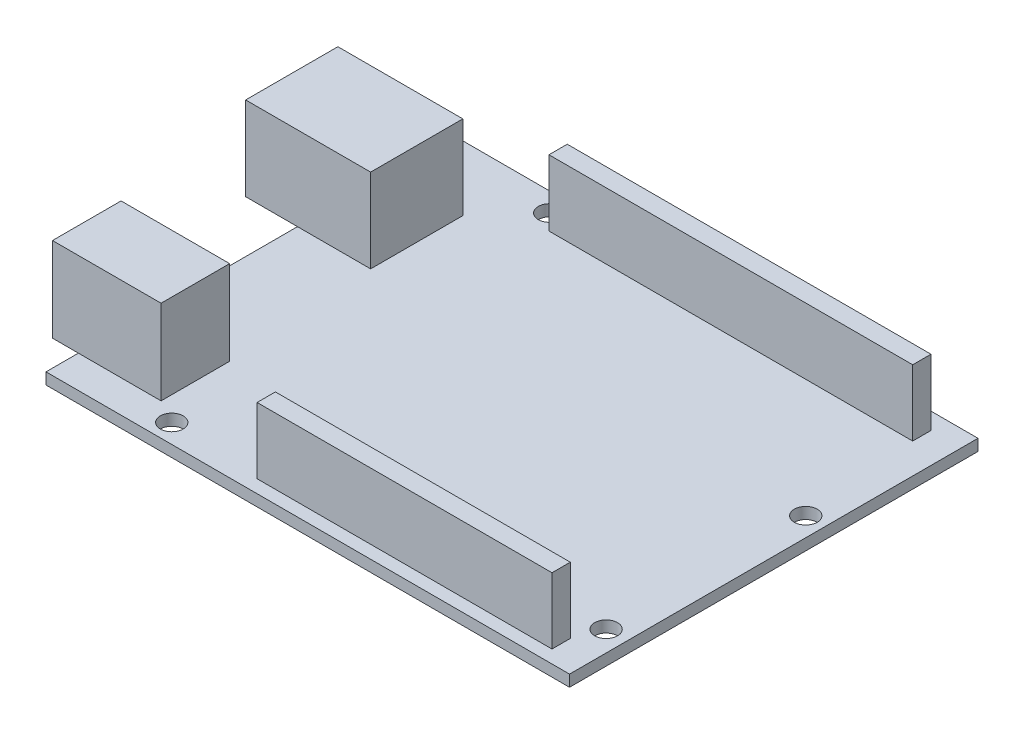
ISO-10303-21;
HEADER;
FILE_DESCRIPTION(('STEP AP214'),'2;1');
FILE_NAME('part.step','',(''),(''),'','','');
FILE_SCHEMA(('AUTOMOTIVE_DESIGN { 1 0 10303 214 1 1 1 1 }'));
ENDSEC;
DATA;
#1=APPLICATION_CONTEXT('core data for automotive mechanical design processes');
#2=APPLICATION_PROTOCOL_DEFINITION('international standard','automotive_design',2000,#1);
#3=PRODUCT_CONTEXT('',#1,'mechanical');
#4=PRODUCT('Part','Part','',(#3));
#5=PRODUCT_RELATED_PRODUCT_CATEGORY('part','',(#4));
#6=PRODUCT_DEFINITION_FORMATION('','',#4);
#7=PRODUCT_DEFINITION_CONTEXT('part definition',#1,'design');
#8=PRODUCT_DEFINITION('design','',#6,#7);
#9=PRODUCT_DEFINITION_SHAPE('','',#8);
#10=(LENGTH_UNIT() NAMED_UNIT(*) SI_UNIT(.MILLI.,.METRE.));
#11=(NAMED_UNIT(*) PLANE_ANGLE_UNIT() SI_UNIT($,.RADIAN.));
#12=(NAMED_UNIT(*) SI_UNIT($,.STERADIAN.) SOLID_ANGLE_UNIT());
#13=UNCERTAINTY_MEASURE_WITH_UNIT(LENGTH_MEASURE(1.E-05),#10,'distance_accuracy_value','');
#14=(GEOMETRIC_REPRESENTATION_CONTEXT(3) GLOBAL_UNCERTAINTY_ASSIGNED_CONTEXT((#13)) GLOBAL_UNIT_ASSIGNED_CONTEXT((#10,
#11,#12)) REPRESENTATION_CONTEXT('',''));
#15=CARTESIAN_POINT('',(0.,0.,0.));
#16=DIRECTION('',(0.,0.,1.));
#17=DIRECTION('',(1.,0.,0.));
#18=AXIS2_PLACEMENT_3D('',#15,#16,#17);
#19=CARTESIAN_POINT('',(0.,1.5,0.));
#20=DIRECTION('',(0.,1.,0.));
#21=DIRECTION('',(0.,0.,1.));
#22=AXIS2_PLACEMENT_3D('',#19,#20,#21);
#23=PLANE('',#22);
#24=CARTESIAN_POINT('',(15.,1.5,-51.1));
#25=DIRECTION('',(0.,1.,0.));
#26=DIRECTION('',(0.,0.,1.));
#27=AXIS2_PLACEMENT_3D('',#24,#25,#26);
#28=CIRCLE('',#27,1.49999999999999);
#29=CARTESIAN_POINT('',(15.,1.5,-49.6));
#30=VERTEX_POINT('',#29);
#31=EDGE_CURVE('E392',#30,#30,#28,.T.);
#32=ORIENTED_EDGE('',*,*,#31,.F.);
#33=EDGE_LOOP('',(#32));
#34=FACE_BOUND('',#33,.T.);
#35=CARTESIAN_POINT('',(14.,1.5,-2.5));
#36=DIRECTION('',(0.,1.,0.));
#37=DIRECTION('',(0.,0.,1.));
#38=AXIS2_PLACEMENT_3D('',#35,#36,#37);
#39=CIRCLE('',#38,1.49999999999999);
#40=CARTESIAN_POINT('',(14.,1.5,-1.00000000000001));
#41=VERTEX_POINT('',#40);
#42=EDGE_CURVE('E396',#41,#41,#39,.T.);
#43=ORIENTED_EDGE('',*,*,#42,.F.);
#44=EDGE_LOOP('',(#43));
#45=FACE_BOUND('',#44,.T.);
#46=CARTESIAN_POINT('',(66.,1.5,-7.5));
#47=DIRECTION('',(0.,1.,0.));
#48=DIRECTION('',(0.,0.,1.));
#49=AXIS2_PLACEMENT_3D('',#46,#47,#48);
#50=CIRCLE('',#49,1.49999999999999);
#51=CARTESIAN_POINT('',(66.,1.5,-6.00000000000001));
#52=VERTEX_POINT('',#51);
#53=EDGE_CURVE('E400',#52,#52,#50,.T.);
#54=ORIENTED_EDGE('',*,*,#53,.F.);
#55=EDGE_LOOP('',(#54));
#56=FACE_BOUND('',#55,.T.);
#57=CARTESIAN_POINT('',(66.2,1.5,-33.5));
#58=DIRECTION('',(0.,1.,0.));
#59=DIRECTION('',(0.,0.,1.));
#60=AXIS2_PLACEMENT_3D('',#57,#58,#59);
#61=CIRCLE('',#60,1.49999999999999);
#62=CARTESIAN_POINT('',(66.2,1.5,-32.));
#63=VERTEX_POINT('',#62);
#64=EDGE_CURVE('E403',#63,#63,#61,.T.);
#65=ORIENTED_EDGE('',*,*,#64,.F.);
#66=EDGE_LOOP('',(#65));
#67=FACE_BOUND('',#66,.T.);
#68=DIRECTION('',(-1.,0.,0.));
#69=VECTOR('',#68,1.);
#70=CARTESIAN_POINT('',(-399969.05,1.5,-1.70000000002801));
#71=LINE('',#70,#69);
#72=CARTESIAN_POINT('',(64.7000000000162,1.5,-1.70000000002801));
#73=VERTEX_POINT('',#72);
#74=CARTESIAN_POINT('',(26.0000000000105,1.5,-1.70000000002801));
#75=VERTEX_POINT('',#74);
#76=EDGE_CURVE('E215',#73,#75,#71,.T.);
#77=ORIENTED_EDGE('',*,*,#76,.T.);
#78=DIRECTION('',(0.,0.,-1.));
#79=VECTOR('',#78,1.);
#80=CARTESIAN_POINT('',(26.0000000000105,1.5,291543.72));
#81=LINE('',#80,#79);
#82=CARTESIAN_POINT('',(26.0000000000105,1.5,-4.099999999994));
#83=VERTEX_POINT('',#82);
#84=EDGE_CURVE('E188',#75,#83,#81,.T.);
#85=ORIENTED_EDGE('',*,*,#84,.T.);
#86=DIRECTION('',(1.,0.,0.));
#87=VECTOR('',#86,1.);
#88=CARTESIAN_POINT('',(-399969.05,1.5,-4.099999999994));
#89=LINE('',#88,#87);
#90=CARTESIAN_POINT('',(64.7000000000162,1.5,-4.099999999994));
#91=VERTEX_POINT('',#90);
#92=EDGE_CURVE('E54',#83,#91,#89,.T.);
#93=ORIENTED_EDGE('',*,*,#92,.T.);
#94=DIRECTION('',(0.,0.,1.));
#95=VECTOR('',#94,1.);
#96=CARTESIAN_POINT('',(64.7000000000162,1.5,291543.72));
#97=LINE('',#96,#95);
#98=EDGE_CURVE('E49',#91,#73,#97,.T.);
#99=ORIENTED_EDGE('',*,*,#98,.T.);
#100=EDGE_LOOP('',(#77,#85,#93,#99));
#101=FACE_BOUND('',#100,.T.);
#102=DIRECTION('',(-1.,0.,0.));
#103=VECTOR('',#102,1.);
#104=CARTESIAN_POINT('',(-399969.05,1.5,-49.000000000035));
#105=LINE('',#104,#103);
#106=CARTESIAN_POINT('',(64.7299999999781,1.5,-48.9999999999782));
#107=VERTEX_POINT('',#106);
#108=CARTESIAN_POINT('',(16.9999999999959,1.5,-48.9999999999782));
#109=VERTEX_POINT('',#108);
#110=EDGE_CURVE('E220',#107,#109,#105,.T.);
#111=ORIENTED_EDGE('',*,*,#110,.T.);
#112=DIRECTION('',(0.,0.,-1.));
#113=VECTOR('',#112,1.);
#114=CARTESIAN_POINT('',(16.9999999999959,1.5,291543.72));
#115=LINE('',#114,#113);
#116=CARTESIAN_POINT('',(16.9999999999959,1.5,-51.400000000001));
#117=VERTEX_POINT('',#116);
#118=EDGE_CURVE('E239',#109,#117,#115,.T.);
#119=ORIENTED_EDGE('',*,*,#118,.T.);
#120=DIRECTION('',(1.,0.,0.));
#121=VECTOR('',#120,1.);
#122=CARTESIAN_POINT('',(-399969.05,1.5,-51.400000000001));
#123=LINE('',#122,#121);
#124=CARTESIAN_POINT('',(64.7299999999781,1.5,-51.400000000001));
#125=VERTEX_POINT('',#124);
#126=EDGE_CURVE('E241',#117,#125,#123,.T.);
#127=ORIENTED_EDGE('',*,*,#126,.T.);
#128=DIRECTION('',(0.,0.,1.));
#129=VECTOR('',#128,1.);
#130=CARTESIAN_POINT('',(64.729999998292,1.5,291543.720000002));
#131=LINE('',#130,#129);
#132=EDGE_CURVE('E228',#125,#107,#131,.T.);
#133=ORIENTED_EDGE('',*,*,#132,.T.);
#134=EDGE_LOOP('',(#111,#119,#127,#133));
#135=FACE_BOUND('',#134,.T.);
#136=DIRECTION('',(-1.,0.,0.));
#137=VECTOR('',#136,1.);
#138=CARTESIAN_POINT('',(-399967.35,1.5,-33.0000000000155));
#139=LINE('',#138,#137);
#140=CARTESIAN_POINT('',(9.59999999995087,1.5,-33.0000000000155));
#141=VERTEX_POINT('',#140);
#142=CARTESIAN_POINT('',(0.,1.5,-33.0000000000155));
#143=VERTEX_POINT('',#142);
#144=EDGE_CURVE('E270',#141,#143,#139,.T.);
#145=ORIENTED_EDGE('',*,*,#144,.T.);
#146=DIRECTION('',(0.,0.,1.));
#147=VECTOR('',#146,1.);
#148=CARTESIAN_POINT('',(0.,1.5,0.));
#149=LINE('',#148,#147);
#150=CARTESIAN_POINT('',(0.,1.5,-13.2500000000277));
#151=VERTEX_POINT('',#150);
#152=EDGE_CURVE('E349',#143,#151,#149,.T.);
#153=ORIENTED_EDGE('',*,*,#152,.T.);
#154=DIRECTION('',(1.,0.,0.));
#155=VECTOR('',#154,1.);
#156=CARTESIAN_POINT('',(-399965.65,1.5,-13.2500000000277));
#157=LINE('',#156,#155);
#158=CARTESIAN_POINT('',(10.8500000000049,1.5,-13.2500000000277));
#159=VERTEX_POINT('',#158);
#160=EDGE_CURVE('E11',#151,#159,#157,.T.);
#161=ORIENTED_EDGE('',*,*,#160,.T.);
#162=DIRECTION('',(0.,0.,1.));
#163=VECTOR('',#162,1.);
#164=CARTESIAN_POINT('',(10.8500000000049,1.5,291543.72));
#165=LINE('',#164,#163);
#166=CARTESIAN_POINT('',(10.8500000000049,1.5,-4.25000000001319));
#167=VERTEX_POINT('',#166);
#168=EDGE_CURVE('E296',#159,#167,#165,.T.);
#169=ORIENTED_EDGE('',*,*,#168,.T.);
#170=DIRECTION('',(-1.,0.,0.));
#171=VECTOR('',#170,1.);
#172=CARTESIAN_POINT('',(-399965.65,1.5,-4.25000000001319));
#173=LINE('',#172,#171);
#174=CARTESIAN_POINT('',(0.,1.5,-4.25000000001319));
#175=VERTEX_POINT('',#174);
#176=EDGE_CURVE('E306',#167,#175,#173,.T.);
#177=ORIENTED_EDGE('',*,*,#176,.T.);
#178=CARTESIAN_POINT('',(0.,1.50000000000003,0.));
#179=VERTEX_POINT('',#178);
#180=EDGE_CURVE('E353',#175,#179,#149,.T.);
#181=ORIENTED_EDGE('',*,*,#180,.T.);
#182=DIRECTION('',(1.,0.,0.));
#183=VECTOR('',#182,1.);
#184=CARTESIAN_POINT('',(0.,1.5,0.));
#185=LINE('',#184,#183);
#186=CARTESIAN_POINT('',(68.7,1.50000000000003,0.));
#187=VERTEX_POINT('',#186);
#188=EDGE_CURVE('E342',#179,#187,#185,.T.);
#189=ORIENTED_EDGE('',*,*,#188,.T.);
#190=DIRECTION('',(0.,0.,-1.));
#191=VECTOR('',#190,1.);
#192=CARTESIAN_POINT('',(68.7,1.5,0.));
#193=LINE('',#192,#191);
#194=CARTESIAN_POINT('',(68.7,1.50000000000003,-53.6));
#195=VERTEX_POINT('',#194);
#196=EDGE_CURVE('E40',#187,#195,#193,.T.);
#197=ORIENTED_EDGE('',*,*,#196,.T.);
#198=DIRECTION('',(-1.,0.,0.));
#199=VECTOR('',#198,1.);
#200=CARTESIAN_POINT('',(0.,1.5,-53.6));
#201=LINE('',#200,#199);
#202=CARTESIAN_POINT('',(0.,1.5,-53.6));
#203=VERTEX_POINT('',#202);
#204=EDGE_CURVE('E327',#195,#203,#201,.T.);
#205=ORIENTED_EDGE('',*,*,#204,.T.);
#206=CARTESIAN_POINT('',(0.,1.5,-45.0999999999908));
#207=VERTEX_POINT('',#206);
#208=EDGE_CURVE('E345',#203,#207,#149,.T.);
#209=ORIENTED_EDGE('',*,*,#208,.T.);
#210=DIRECTION('',(1.,0.,0.));
#211=VECTOR('',#210,1.);
#212=CARTESIAN_POINT('',(-399967.35,1.5,-45.0999999999908));
#213=LINE('',#212,#211);
#214=CARTESIAN_POINT('',(9.59999999995086,1.5,-45.0999999999908));
#215=VERTEX_POINT('',#214);
#216=EDGE_CURVE('E276',#207,#215,#213,.T.);
#217=ORIENTED_EDGE('',*,*,#216,.T.);
#218=DIRECTION('',(0.,0.,1.));
#219=VECTOR('',#218,1.);
#220=CARTESIAN_POINT('',(9.60000000003447,1.5,291543.72));
#221=LINE('',#220,#219);
#222=EDGE_CURVE('E260',#215,#141,#221,.T.);
#223=ORIENTED_EDGE('',*,*,#222,.T.);
#224=EDGE_LOOP('',(#145,#153,#161,#169,#177,#181,#189,#197,#205,#209,#217,#223));
#225=FACE_BOUND('',#224,.T.);
#226=ADVANCED_FACE('F32',(#34,#45,#56,#67,#101,#135,#225),#23,.T.);
#227=CARTESIAN_POINT('',(0.,88.6358135326686,0.));
#228=DIRECTION('',(1.,0.,0.));
#229=DIRECTION('',(0.,0.,-1.));
#230=AXIS2_PLACEMENT_3D('',#227,#228,#229);
#231=PLANE('',#230);
#232=ORIENTED_EDGE('',*,*,#208,.F.);
#233=DIRECTION('',(0.,-1.,0.));
#234=VECTOR('',#233,1.);
#235=CARTESIAN_POINT('',(0.,88.6358135326686,-53.6));
#236=LINE('',#235,#234);
#237=CARTESIAN_POINT('',(0.,0.,-53.6));
#238=VERTEX_POINT('',#237);
#239=EDGE_CURVE('E35',#203,#238,#236,.T.);
#240=ORIENTED_EDGE('',*,*,#239,.T.);
#241=DIRECTION('',(0.,0.,1.));
#242=VECTOR('',#241,1.);
#243=CARTESIAN_POINT('',(0.,0.,0.));
#244=LINE('',#243,#242);
#245=CARTESIAN_POINT('',(0.,0.,0.));
#246=VERTEX_POINT('',#245);
#247=EDGE_CURVE('E337',#238,#246,#244,.T.);
#248=ORIENTED_EDGE('',*,*,#247,.T.);
#249=DIRECTION('',(0.,-1.,0.));
#250=VECTOR('',#249,1.);
#251=CARTESIAN_POINT('',(0.,88.6358135326686,0.));
#252=LINE('',#251,#250);
#253=EDGE_CURVE('E336',#179,#246,#252,.T.);
#254=ORIENTED_EDGE('',*,*,#253,.F.);
#255=ORIENTED_EDGE('',*,*,#180,.F.);
#256=EDGE_CURVE('E350',#151,#175,#149,.T.);
#257=ORIENTED_EDGE('',*,*,#256,.F.);
#258=ORIENTED_EDGE('',*,*,#152,.F.);
#259=EDGE_CURVE('E348',#207,#143,#149,.T.);
#260=ORIENTED_EDGE('',*,*,#259,.F.);
#261=EDGE_LOOP('',(#232,#240,#248,#254,#255,#257,#258,#260));
#262=FACE_BOUND('',#261,.T.);
#263=ADVANCED_FACE('F370',(#262),#231,.F.);
#264=CARTESIAN_POINT('',(0.,88.6358135326686,0.));
#265=DIRECTION('',(0.,0.,-1.));
#266=DIRECTION('',(-1.,0.,0.));
#267=AXIS2_PLACEMENT_3D('',#264,#265,#266);
#268=PLANE('',#267);
#269=ORIENTED_EDGE('',*,*,#188,.F.);
#270=ORIENTED_EDGE('',*,*,#253,.T.);
#271=DIRECTION('',(1.,0.,0.));
#272=VECTOR('',#271,1.);
#273=CARTESIAN_POINT('',(0.,0.,0.));
#274=LINE('',#273,#272);
#275=CARTESIAN_POINT('',(68.7,0.,0.));
#276=VERTEX_POINT('',#275);
#277=EDGE_CURVE('E333',#246,#276,#274,.T.);
#278=ORIENTED_EDGE('',*,*,#277,.T.);
#279=DIRECTION('',(0.,-1.,0.));
#280=VECTOR('',#279,1.);
#281=CARTESIAN_POINT('',(68.7,88.6358135326686,0.));
#282=LINE('',#281,#280);
#283=EDGE_CURVE('E332',#187,#276,#282,.T.);
#284=ORIENTED_EDGE('',*,*,#283,.F.);
#285=EDGE_LOOP('',(#269,#270,#278,#284));
#286=FACE_BOUND('',#285,.T.);
#287=ADVANCED_FACE('F377',(#286),#268,.F.);
#288=CARTESIAN_POINT('',(68.7,88.6358135326686,0.));
#289=DIRECTION('',(-1.,0.,0.));
#290=DIRECTION('',(0.,0.,1.));
#291=AXIS2_PLACEMENT_3D('',#288,#289,#290);
#292=PLANE('',#291);
#293=ORIENTED_EDGE('',*,*,#196,.F.);
#294=ORIENTED_EDGE('',*,*,#283,.T.);
#295=DIRECTION('',(0.,0.,-1.));
#296=VECTOR('',#295,1.);
#297=CARTESIAN_POINT('',(68.7,0.,0.));
#298=LINE('',#297,#296);
#299=CARTESIAN_POINT('',(68.7,0.,-53.6));
#300=VERTEX_POINT('',#299);
#301=EDGE_CURVE('E329',#276,#300,#298,.T.);
#302=ORIENTED_EDGE('',*,*,#301,.T.);
#303=DIRECTION('',(0.,-1.,0.));
#304=VECTOR('',#303,1.);
#305=CARTESIAN_POINT('',(68.7,88.6358135326686,-53.6));
#306=LINE('',#305,#304);
#307=EDGE_CURVE('E328',#195,#300,#306,.T.);
#308=ORIENTED_EDGE('',*,*,#307,.F.);
#309=EDGE_LOOP('',(#293,#294,#302,#308));
#310=FACE_BOUND('',#309,.T.);
#311=ADVANCED_FACE('F362',(#310),#292,.F.);
#312=CARTESIAN_POINT('',(0.,88.6358135326686,-53.6));
#313=DIRECTION('',(0.,0.,1.));
#314=DIRECTION('',(1.,0.,0.));
#315=AXIS2_PLACEMENT_3D('',#312,#313,#314);
#316=PLANE('',#315);
#317=ORIENTED_EDGE('',*,*,#204,.F.);
#318=ORIENTED_EDGE('',*,*,#307,.T.);
#319=DIRECTION('',(-1.,0.,0.));
#320=VECTOR('',#319,1.);
#321=CARTESIAN_POINT('',(0.,0.,-53.6));
#322=LINE('',#321,#320);
#323=EDGE_CURVE('E324',#300,#238,#322,.T.);
#324=ORIENTED_EDGE('',*,*,#323,.T.);
#325=ORIENTED_EDGE('',*,*,#239,.F.);
#326=EDGE_LOOP('',(#317,#318,#324,#325));
#327=FACE_BOUND('',#326,.T.);
#328=ADVANCED_FACE('F357',(#327),#316,.F.);
#329=CARTESIAN_POINT('',(0.,0.,0.));
#330=DIRECTION('',(0.,-1.,0.));
#331=DIRECTION('',(0.,0.,-1.));
#332=AXIS2_PLACEMENT_3D('',#329,#330,#331);
#333=PLANE('',#332);
#334=CARTESIAN_POINT('',(15.,0.,-51.1));
#335=DIRECTION('',(0.,-1.,0.));
#336=DIRECTION('',(0.,0.,-1.));
#337=AXIS2_PLACEMENT_3D('',#334,#335,#336);
#338=CIRCLE('',#337,1.49999999999999);
#339=CARTESIAN_POINT('',(15.,0.,-52.6));
#340=VERTEX_POINT('',#339);
#341=EDGE_CURVE('E707',#340,#340,#338,.T.);
#342=ORIENTED_EDGE('',*,*,#341,.F.);
#343=EDGE_LOOP('',(#342));
#344=FACE_BOUND('',#343,.T.);
#345=CARTESIAN_POINT('',(14.,0.,-2.5));
#346=DIRECTION('',(0.,-1.,0.));
#347=DIRECTION('',(0.,0.,-1.));
#348=AXIS2_PLACEMENT_3D('',#345,#346,#347);
#349=CIRCLE('',#348,1.49999999999999);
#350=CARTESIAN_POINT('',(14.,0.,-3.99999999999999));
#351=VERTEX_POINT('',#350);
#352=EDGE_CURVE('E712',#351,#351,#349,.T.);
#353=ORIENTED_EDGE('',*,*,#352,.F.);
#354=EDGE_LOOP('',(#353));
#355=FACE_BOUND('',#354,.T.);
#356=CARTESIAN_POINT('',(66.,0.,-7.5));
#357=DIRECTION('',(0.,-1.,0.));
#358=DIRECTION('',(0.,0.,-1.));
#359=AXIS2_PLACEMENT_3D('',#356,#357,#358);
#360=CIRCLE('',#359,1.49999999999999);
#361=CARTESIAN_POINT('',(66.,0.,-8.99999999999999));
#362=VERTEX_POINT('',#361);
#363=EDGE_CURVE('E716',#362,#362,#360,.T.);
#364=ORIENTED_EDGE('',*,*,#363,.F.);
#365=EDGE_LOOP('',(#364));
#366=FACE_BOUND('',#365,.T.);
#367=CARTESIAN_POINT('',(66.2,0.,-33.5));
#368=DIRECTION('',(0.,-1.,0.));
#369=DIRECTION('',(0.,0.,-1.));
#370=AXIS2_PLACEMENT_3D('',#367,#368,#369);
#371=CIRCLE('',#370,1.49999999999999);
#372=CARTESIAN_POINT('',(66.2,0.,-35.));
#373=VERTEX_POINT('',#372);
#374=EDGE_CURVE('E210',#373,#373,#371,.T.);
#375=ORIENTED_EDGE('',*,*,#374,.F.);
#376=EDGE_LOOP('',(#375));
#377=FACE_BOUND('',#376,.T.);
#378=ORIENTED_EDGE('',*,*,#247,.F.);
#379=ORIENTED_EDGE('',*,*,#323,.F.);
#380=ORIENTED_EDGE('',*,*,#301,.F.);
#381=ORIENTED_EDGE('',*,*,#277,.F.);
#382=EDGE_LOOP('',(#378,#379,#380,#381));
#383=FACE_BOUND('',#382,.T.);
#384=ADVANCED_FACE('F366',(#344,#355,#366,#377,#383),#333,.T.);
#385=CARTESIAN_POINT('',(-399965.65,12.6,-4.25000000001319));
#386=DIRECTION('',(0.,0.,1.));
#387=DIRECTION('',(1.,0.,0.));
#388=AXIS2_PLACEMENT_3D('',#385,#386,#387);
#389=PLANE('',#388);
#390=ORIENTED_EDGE('',*,*,#176,.F.);
#391=DIRECTION('',(0.,-1.,0.));
#392=VECTOR('',#391,1.);
#393=CARTESIAN_POINT('',(10.8500000000049,12.6,-4.25000000001319));
#394=LINE('',#393,#392);
#395=CARTESIAN_POINT('',(10.8500000000049,12.6,-4.25000000001319));
#396=VERTEX_POINT('',#395);
#397=EDGE_CURVE('E315',#396,#167,#394,.T.);
#398=ORIENTED_EDGE('',*,*,#397,.F.);
#399=DIRECTION('',(-1.,0.,0.));
#400=VECTOR('',#399,1.);
#401=CARTESIAN_POINT('',(-399965.65,12.6,-4.25000000001319));
#402=LINE('',#401,#400);
#403=CARTESIAN_POINT('',(-3.39999999998448,12.6,-4.25000000001319));
#404=VERTEX_POINT('',#403);
#405=EDGE_CURVE('E292',#396,#404,#402,.T.);
#406=ORIENTED_EDGE('',*,*,#405,.T.);
#407=DIRECTION('',(0.,-1.,0.));
#408=VECTOR('',#407,1.);
#409=CARTESIAN_POINT('',(-3.39999999998448,12.6,-4.25000000001319));
#410=LINE('',#409,#408);
#411=CARTESIAN_POINT('',(-3.39999999998448,1.5,-4.25000000001319));
#412=VERTEX_POINT('',#411);
#413=EDGE_CURVE('E305',#404,#412,#410,.T.);
#414=ORIENTED_EDGE('',*,*,#413,.T.);
#415=EDGE_CURVE('E284',#175,#412,#173,.T.);
#416=ORIENTED_EDGE('',*,*,#415,.F.);
#417=EDGE_LOOP('',(#390,#398,#406,#414,#416));
#418=FACE_BOUND('',#417,.T.);
#419=ADVANCED_FACE('F477',(#418),#389,.T.);
#420=CARTESIAN_POINT('',(10.8500000000049,12.6,291543.72));
#421=DIRECTION('',(1.,0.,0.));
#422=DIRECTION('',(0.,0.,-1.));
#423=AXIS2_PLACEMENT_3D('',#420,#421,#422);
#424=PLANE('',#423);
#425=ORIENTED_EDGE('',*,*,#168,.F.);
#426=DIRECTION('',(0.,-1.,0.));
#427=VECTOR('',#426,1.);
#428=CARTESIAN_POINT('',(10.8500000000049,12.6,-13.2500000000277));
#429=LINE('',#428,#427);
#430=CARTESIAN_POINT('',(10.8500000000049,12.6,-13.2500000000277));
#431=VERTEX_POINT('',#430);
#432=EDGE_CURVE('E318',#431,#159,#429,.T.);
#433=ORIENTED_EDGE('',*,*,#432,.F.);
#434=DIRECTION('',(0.,0.,1.));
#435=VECTOR('',#434,1.);
#436=CARTESIAN_POINT('',(10.8500000000049,12.6,291543.72));
#437=LINE('',#436,#435);
#438=EDGE_CURVE('E302',#431,#396,#437,.T.);
#439=ORIENTED_EDGE('',*,*,#438,.T.);
#440=ORIENTED_EDGE('',*,*,#397,.T.);
#441=EDGE_LOOP('',(#425,#433,#439,#440));
#442=FACE_BOUND('',#441,.T.);
#443=ADVANCED_FACE('F473',(#442),#424,.T.);
#444=CARTESIAN_POINT('',(-399965.65,12.6,-13.2500000000277));
#445=DIRECTION('',(0.,0.,-1.));
#446=DIRECTION('',(-1.,0.,0.));
#447=AXIS2_PLACEMENT_3D('',#444,#445,#446);
#448=PLANE('',#447);
#449=CARTESIAN_POINT('',(-3.39999999999918,1.5,-13.2500000000277));
#450=VERTEX_POINT('',#449);
#451=EDGE_CURVE('E42',#450,#151,#157,.T.);
#452=ORIENTED_EDGE('',*,*,#451,.F.);
#453=DIRECTION('',(0.,-1.,0.));
#454=VECTOR('',#453,1.);
#455=CARTESIAN_POINT('',(-3.39999999999918,12.6,-13.2500000000277));
#456=LINE('',#455,#454);
#457=CARTESIAN_POINT('',(-3.39999999999918,12.6,-13.2500000000277));
#458=VERTEX_POINT('',#457);
#459=EDGE_CURVE('E320',#458,#450,#456,.T.);
#460=ORIENTED_EDGE('',*,*,#459,.F.);
#461=DIRECTION('',(1.,0.,0.));
#462=VECTOR('',#461,1.);
#463=CARTESIAN_POINT('',(-399965.65,12.6,-13.2500000000277));
#464=LINE('',#463,#462);
#465=EDGE_CURVE('E299',#458,#431,#464,.T.);
#466=ORIENTED_EDGE('',*,*,#465,.T.);
#467=ORIENTED_EDGE('',*,*,#432,.T.);
#468=ORIENTED_EDGE('',*,*,#160,.F.);
#469=EDGE_LOOP('',(#452,#460,#466,#467,#468));
#470=FACE_BOUND('',#469,.T.);
#471=ADVANCED_FACE('F476',(#470),#448,.T.);
#472=CARTESIAN_POINT('',(-3.39999999994234,12.6,291543.72));
#473=DIRECTION('',(-1.,0.,0.));
#474=DIRECTION('',(0.,0.,1.));
#475=AXIS2_PLACEMENT_3D('',#472,#473,#474);
#476=PLANE('',#475);
#477=DIRECTION('',(0.,0.,-1.));
#478=VECTOR('',#477,1.);
#479=CARTESIAN_POINT('',(-3.39999999994234,1.5,291543.72));
#480=LINE('',#479,#478);
#481=EDGE_CURVE('E309',#412,#450,#480,.T.);
#482=ORIENTED_EDGE('',*,*,#481,.F.);
#483=ORIENTED_EDGE('',*,*,#413,.F.);
#484=DIRECTION('',(0.,0.,-1.));
#485=VECTOR('',#484,1.);
#486=CARTESIAN_POINT('',(-3.39999999994234,12.6,291543.72));
#487=LINE('',#486,#485);
#488=EDGE_CURVE('E295',#404,#458,#487,.T.);
#489=ORIENTED_EDGE('',*,*,#488,.T.);
#490=ORIENTED_EDGE('',*,*,#459,.T.);
#491=EDGE_LOOP('',(#482,#483,#489,#490));
#492=FACE_BOUND('',#491,.T.);
#493=ADVANCED_FACE('F468',(#492),#476,.T.);
#494=CARTESIAN_POINT('',(0.,12.6,0.));
#495=DIRECTION('',(0.,-1.,0.));
#496=DIRECTION('',(0.,0.,-1.));
#497=AXIS2_PLACEMENT_3D('',#494,#495,#496);
#498=PLANE('',#497);
#499=ORIENTED_EDGE('',*,*,#405,.F.);
#500=ORIENTED_EDGE('',*,*,#438,.F.);
#501=ORIENTED_EDGE('',*,*,#465,.F.);
#502=ORIENTED_EDGE('',*,*,#488,.F.);
#503=EDGE_LOOP('',(#499,#500,#501,#502));
#504=FACE_BOUND('',#503,.T.);
#505=ADVANCED_FACE('F465',(#504),#498,.F.);
#506=CARTESIAN_POINT('',(0.,1.5,0.));
#507=DIRECTION('',(0.,-1.,0.));
#508=DIRECTION('',(0.,0.,-1.));
#509=AXIS2_PLACEMENT_3D('',#506,#507,#508);
#510=PLANE('',#509);
#511=ORIENTED_EDGE('',*,*,#451,.T.);
#512=ORIENTED_EDGE('',*,*,#256,.T.);
#513=ORIENTED_EDGE('',*,*,#415,.T.);
#514=ORIENTED_EDGE('',*,*,#481,.T.);
#515=EDGE_LOOP('',(#511,#512,#513,#514));
#516=FACE_BOUND('',#515,.T.);
#517=ADVANCED_FACE('F449',(#516),#510,.T.);
#518=CARTESIAN_POINT('',(0.,1.5,0.));
#519=DIRECTION('',(0.,-1.,0.));
#520=DIRECTION('',(0.,0.,-1.));
#521=AXIS2_PLACEMENT_3D('',#518,#519,#520);
#522=PLANE('',#521);
#523=ORIENTED_EDGE('',*,*,#259,.T.);
#524=CARTESIAN_POINT('',(-6.79999999998,1.5,-33.0000000000155));
#525=VERTEX_POINT('',#524);
#526=EDGE_CURVE('E247',#143,#525,#139,.T.);
#527=ORIENTED_EDGE('',*,*,#526,.T.);
#528=DIRECTION('',(0.,0.,-1.));
#529=VECTOR('',#528,1.);
#530=CARTESIAN_POINT('',(-6.79999999977099,1.5,291543.72));
#531=LINE('',#530,#529);
#532=CARTESIAN_POINT('',(-6.79999999999836,1.5,-45.0999999999908));
#533=VERTEX_POINT('',#532);
#534=EDGE_CURVE('E273',#525,#533,#531,.T.);
#535=ORIENTED_EDGE('',*,*,#534,.T.);
#536=EDGE_CURVE('E277',#533,#207,#213,.T.);
#537=ORIENTED_EDGE('',*,*,#536,.T.);
#538=EDGE_LOOP('',(#523,#527,#535,#537));
#539=FACE_BOUND('',#538,.T.);
#540=ADVANCED_FACE('F445',(#539),#522,.T.);
#541=CARTESIAN_POINT('',(-399967.35,12.5,-33.0000000000155));
#542=DIRECTION('',(0.,0.,1.));
#543=DIRECTION('',(1.,0.,0.));
#544=AXIS2_PLACEMENT_3D('',#541,#542,#543);
#545=PLANE('',#544);
#546=ORIENTED_EDGE('',*,*,#144,.F.);
#547=DIRECTION('',(0.,-1.,0.));
#548=VECTOR('',#547,1.);
#549=CARTESIAN_POINT('',(9.59999999995087,12.5,-33.0000000000155));
#550=LINE('',#549,#548);
#551=CARTESIAN_POINT('',(9.59999999995087,12.5,-33.0000000000155));
#552=VERTEX_POINT('',#551);
#553=EDGE_CURVE('E281',#552,#141,#550,.T.);
#554=ORIENTED_EDGE('',*,*,#553,.F.);
#555=DIRECTION('',(-1.,0.,0.));
#556=VECTOR('',#555,1.);
#557=CARTESIAN_POINT('',(-399967.35,12.5,-33.0000000000155));
#558=LINE('',#557,#556);
#559=CARTESIAN_POINT('',(-6.79999999998,12.5,-33.0000000000155));
#560=VERTEX_POINT('',#559);
#561=EDGE_CURVE('E256',#552,#560,#558,.T.);
#562=ORIENTED_EDGE('',*,*,#561,.T.);
#563=DIRECTION('',(0.,-1.,0.));
#564=VECTOR('',#563,1.);
#565=CARTESIAN_POINT('',(-6.79999999998,12.5,-33.0000000000155));
#566=LINE('',#565,#564);
#567=EDGE_CURVE('E269',#560,#525,#566,.T.);
#568=ORIENTED_EDGE('',*,*,#567,.T.);
#569=ORIENTED_EDGE('',*,*,#526,.F.);
#570=EDGE_LOOP('',(#546,#554,#562,#568,#569));
#571=FACE_BOUND('',#570,.T.);
#572=ADVANCED_FACE('F448',(#571),#545,.T.);
#573=CARTESIAN_POINT('',(9.60000000003447,12.5,291543.72));
#574=DIRECTION('',(1.,0.,0.));
#575=DIRECTION('',(0.,0.,-1.));
#576=AXIS2_PLACEMENT_3D('',#573,#574,#575);
#577=PLANE('',#576);
#578=ORIENTED_EDGE('',*,*,#222,.F.);
#579=DIRECTION('',(0.,-1.,0.));
#580=VECTOR('',#579,1.);
#581=CARTESIAN_POINT('',(9.59999999995086,12.5,-45.0999999999908));
#582=LINE('',#581,#580);
#583=CARTESIAN_POINT('',(9.59999999995086,12.5,-45.0999999999908));
#584=VERTEX_POINT('',#583);
#585=EDGE_CURVE('E285',#584,#215,#582,.T.);
#586=ORIENTED_EDGE('',*,*,#585,.F.);
#587=DIRECTION('',(0.,0.,1.));
#588=VECTOR('',#587,1.);
#589=CARTESIAN_POINT('',(9.60000000003447,12.5,291543.72));
#590=LINE('',#589,#588);
#591=EDGE_CURVE('E266',#584,#552,#590,.T.);
#592=ORIENTED_EDGE('',*,*,#591,.T.);
#593=ORIENTED_EDGE('',*,*,#553,.T.);
#594=EDGE_LOOP('',(#578,#586,#592,#593));
#595=FACE_BOUND('',#594,.T.);
#596=ADVANCED_FACE('F451',(#595),#577,.T.);
#597=CARTESIAN_POINT('',(-399967.35,12.5,-45.0999999999908));
#598=DIRECTION('',(0.,0.,-1.));
#599=DIRECTION('',(-1.,0.,0.));
#600=AXIS2_PLACEMENT_3D('',#597,#598,#599);
#601=PLANE('',#600);
#602=ORIENTED_EDGE('',*,*,#536,.F.);
#603=DIRECTION('',(0.,-1.,0.));
#604=VECTOR('',#603,1.);
#605=CARTESIAN_POINT('',(-6.79999999999836,12.5,-45.0999999999908));
#606=LINE('',#605,#604);
#607=CARTESIAN_POINT('',(-6.79999999999836,12.5,-45.0999999999908));
#608=VERTEX_POINT('',#607);
#609=EDGE_CURVE('E288',#608,#533,#606,.T.);
#610=ORIENTED_EDGE('',*,*,#609,.F.);
#611=DIRECTION('',(1.,0.,0.));
#612=VECTOR('',#611,1.);
#613=CARTESIAN_POINT('',(-399967.35,12.5,-45.0999999999908));
#614=LINE('',#613,#612);
#615=EDGE_CURVE('E263',#608,#584,#614,.T.);
#616=ORIENTED_EDGE('',*,*,#615,.T.);
#617=ORIENTED_EDGE('',*,*,#585,.T.);
#618=ORIENTED_EDGE('',*,*,#216,.F.);
#619=EDGE_LOOP('',(#602,#610,#616,#617,#618));
#620=FACE_BOUND('',#619,.T.);
#621=ADVANCED_FACE('F454',(#620),#601,.T.);
#622=CARTESIAN_POINT('',(-6.79999999977099,12.5,291543.72));
#623=DIRECTION('',(-1.,0.,0.));
#624=DIRECTION('',(0.,0.,1.));
#625=AXIS2_PLACEMENT_3D('',#622,#623,#624);
#626=PLANE('',#625);
#627=ORIENTED_EDGE('',*,*,#534,.F.);
#628=ORIENTED_EDGE('',*,*,#567,.F.);
#629=DIRECTION('',(0.,0.,-1.));
#630=VECTOR('',#629,1.);
#631=CARTESIAN_POINT('',(-6.79999999977099,12.5,291543.72));
#632=LINE('',#631,#630);
#633=EDGE_CURVE('E259',#560,#608,#632,.T.);
#634=ORIENTED_EDGE('',*,*,#633,.T.);
#635=ORIENTED_EDGE('',*,*,#609,.T.);
#636=EDGE_LOOP('',(#627,#628,#634,#635));
#637=FACE_BOUND('',#636,.T.);
#638=ADVANCED_FACE('F443',(#637),#626,.T.);
#639=CARTESIAN_POINT('',(0.,12.5,0.));
#640=DIRECTION('',(0.,-1.,0.));
#641=DIRECTION('',(0.,0.,-1.));
#642=AXIS2_PLACEMENT_3D('',#639,#640,#641);
#643=PLANE('',#642);
#644=ORIENTED_EDGE('',*,*,#561,.F.);
#645=ORIENTED_EDGE('',*,*,#591,.F.);
#646=ORIENTED_EDGE('',*,*,#615,.F.);
#647=ORIENTED_EDGE('',*,*,#633,.F.);
#648=EDGE_LOOP('',(#644,#645,#646,#647));
#649=FACE_BOUND('',#648,.T.);
#650=ADVANCED_FACE('F440',(#649),#643,.F.);
#651=CARTESIAN_POINT('',(-399969.05,10.17,-49.000000000035));
#652=DIRECTION('',(0.,0.,1.));
#653=DIRECTION('',(1.,0.,0.));
#654=AXIS2_PLACEMENT_3D('',#651,#652,#653);
#655=PLANE('',#654);
#656=ORIENTED_EDGE('',*,*,#110,.F.);
#657=DIRECTION('',(0.,-1.,0.));
#658=VECTOR('',#657,1.);
#659=CARTESIAN_POINT('',(64.7299999999781,10.17,-48.9999999999782));
#660=LINE('',#659,#658);
#661=CARTESIAN_POINT('',(64.7299999999781,10.17,-48.9999999999782));
#662=VERTEX_POINT('',#661);
#663=EDGE_CURVE('E244',#662,#107,#660,.T.);
#664=ORIENTED_EDGE('',*,*,#663,.F.);
#665=DIRECTION('',(-1.,0.,0.));
#666=VECTOR('',#665,1.);
#667=CARTESIAN_POINT('',(-399969.05,10.17,-49.000000000035));
#668=LINE('',#667,#666);
#669=CARTESIAN_POINT('',(16.9999999999959,10.17,-48.9999999999782));
#670=VERTEX_POINT('',#669);
#671=EDGE_CURVE('E224',#662,#670,#668,.T.);
#672=ORIENTED_EDGE('',*,*,#671,.T.);
#673=DIRECTION('',(0.,-1.,0.));
#674=VECTOR('',#673,1.);
#675=CARTESIAN_POINT('',(16.9999999999959,10.17,-48.9999999999782));
#676=LINE('',#675,#674);
#677=EDGE_CURVE('E237',#670,#109,#676,.T.);
#678=ORIENTED_EDGE('',*,*,#677,.T.);
#679=EDGE_LOOP('',(#656,#664,#672,#678));
#680=FACE_BOUND('',#679,.T.);
#681=ADVANCED_FACE('F409',(#680),#655,.T.);
#682=CARTESIAN_POINT('',(64.729999998292,10.17,291543.720000002));
#683=DIRECTION('',(1.,0.,0.));
#684=DIRECTION('',(0.,0.,-1.));
#685=AXIS2_PLACEMENT_3D('',#682,#683,#684);
#686=PLANE('',#685);
#687=ORIENTED_EDGE('',*,*,#132,.F.);
#688=DIRECTION('',(0.,-1.,0.));
#689=VECTOR('',#688,1.);
#690=CARTESIAN_POINT('',(64.7299999999781,10.17,-51.400000000001));
#691=LINE('',#690,#689);
#692=CARTESIAN_POINT('',(64.7299999999781,10.17,-51.400000000001));
#693=VERTEX_POINT('',#692);
#694=EDGE_CURVE('E248',#693,#125,#691,.T.);
#695=ORIENTED_EDGE('',*,*,#694,.F.);
#696=DIRECTION('',(0.,0.,1.));
#697=VECTOR('',#696,1.);
#698=CARTESIAN_POINT('',(64.729999998292,10.17,291543.720000002));
#699=LINE('',#698,#697);
#700=EDGE_CURVE('E234',#693,#662,#699,.T.);
#701=ORIENTED_EDGE('',*,*,#700,.T.);
#702=ORIENTED_EDGE('',*,*,#663,.T.);
#703=EDGE_LOOP('',(#687,#695,#701,#702));
#704=FACE_BOUND('',#703,.T.);
#705=ADVANCED_FACE('F420',(#704),#686,.T.);
#706=CARTESIAN_POINT('',(-399969.05,10.17,-51.400000000001));
#707=DIRECTION('',(0.,0.,-1.));
#708=DIRECTION('',(-1.,0.,0.));
#709=AXIS2_PLACEMENT_3D('',#706,#707,#708);
#710=PLANE('',#709);
#711=ORIENTED_EDGE('',*,*,#126,.F.);
#712=DIRECTION('',(0.,-1.,0.));
#713=VECTOR('',#712,1.);
#714=CARTESIAN_POINT('',(16.9999999999959,10.17,-51.400000000001));
#715=LINE('',#714,#713);
#716=CARTESIAN_POINT('',(16.9999999999959,10.17,-51.400000000001));
#717=VERTEX_POINT('',#716);
#718=EDGE_CURVE('E251',#717,#117,#715,.T.);
#719=ORIENTED_EDGE('',*,*,#718,.F.);
#720=DIRECTION('',(1.,0.,0.));
#721=VECTOR('',#720,1.);
#722=CARTESIAN_POINT('',(-399969.05,10.17,-51.400000000001));
#723=LINE('',#722,#721);
#724=EDGE_CURVE('E231',#717,#693,#723,.T.);
#725=ORIENTED_EDGE('',*,*,#724,.T.);
#726=ORIENTED_EDGE('',*,*,#694,.T.);
#727=EDGE_LOOP('',(#711,#719,#725,#726));
#728=FACE_BOUND('',#727,.T.);
#729=ADVANCED_FACE('F417',(#728),#710,.T.);
#730=CARTESIAN_POINT('',(16.9999999999959,10.17,291543.72));
#731=DIRECTION('',(-1.,0.,0.));
#732=DIRECTION('',(0.,0.,1.));
#733=AXIS2_PLACEMENT_3D('',#730,#731,#732);
#734=PLANE('',#733);
#735=ORIENTED_EDGE('',*,*,#118,.F.);
#736=ORIENTED_EDGE('',*,*,#677,.F.);
#737=DIRECTION('',(0.,0.,-1.));
#738=VECTOR('',#737,1.);
#739=CARTESIAN_POINT('',(16.9999999999959,10.17,291543.72));
#740=LINE('',#739,#738);
#741=EDGE_CURVE('E227',#670,#717,#740,.T.);
#742=ORIENTED_EDGE('',*,*,#741,.T.);
#743=ORIENTED_EDGE('',*,*,#718,.T.);
#744=EDGE_LOOP('',(#735,#736,#742,#743));
#745=FACE_BOUND('',#744,.T.);
#746=ADVANCED_FACE('F413',(#745),#734,.T.);
#747=CARTESIAN_POINT('',(0.,10.17,0.));
#748=DIRECTION('',(0.,-1.,0.));
#749=DIRECTION('',(0.,0.,-1.));
#750=AXIS2_PLACEMENT_3D('',#747,#748,#749);
#751=PLANE('',#750);
#752=ORIENTED_EDGE('',*,*,#671,.F.);
#753=ORIENTED_EDGE('',*,*,#700,.F.);
#754=ORIENTED_EDGE('',*,*,#724,.F.);
#755=ORIENTED_EDGE('',*,*,#741,.F.);
#756=EDGE_LOOP('',(#752,#753,#754,#755));
#757=FACE_BOUND('',#756,.T.);
#758=ADVANCED_FACE('F422',(#757),#751,.F.);
#759=CARTESIAN_POINT('',(-399969.05,10.17,-1.70000000002801));
#760=DIRECTION('',(0.,0.,1.));
#761=DIRECTION('',(1.,0.,0.));
#762=AXIS2_PLACEMENT_3D('',#759,#760,#761);
#763=PLANE('',#762);
#764=ORIENTED_EDGE('',*,*,#76,.F.);
#765=DIRECTION('',(0.,-1.,0.));
#766=VECTOR('',#765,1.);
#767=CARTESIAN_POINT('',(64.7000000000162,10.17,-1.70000000002801));
#768=LINE('',#767,#766);
#769=CARTESIAN_POINT('',(64.7000000000162,10.17,-1.70000000002801));
#770=VERTEX_POINT('',#769);
#771=EDGE_CURVE('E206',#770,#73,#768,.T.);
#772=ORIENTED_EDGE('',*,*,#771,.F.);
#773=DIRECTION('',(-1.,0.,0.));
#774=VECTOR('',#773,1.);
#775=CARTESIAN_POINT('',(-399969.05,10.17,-1.70000000002801));
#776=LINE('',#775,#774);
#777=CARTESIAN_POINT('',(26.0000000000105,10.17,-1.70000000002801));
#778=VERTEX_POINT('',#777);
#779=EDGE_CURVE('E200',#770,#778,#776,.T.);
#780=ORIENTED_EDGE('',*,*,#779,.T.);
#781=DIRECTION('',(0.,-1.,0.));
#782=VECTOR('',#781,1.);
#783=CARTESIAN_POINT('',(26.0000000000105,10.17,-1.70000000002801));
#784=LINE('',#783,#782);
#785=EDGE_CURVE('E183',#778,#75,#784,.T.);
#786=ORIENTED_EDGE('',*,*,#785,.T.);
#787=EDGE_LOOP('',(#764,#772,#780,#786));
#788=FACE_BOUND('',#787,.T.);
#789=ADVANCED_FACE('F205',(#788),#763,.T.);
#790=CARTESIAN_POINT('',(64.7000000000162,10.17,291543.72));
#791=DIRECTION('',(1.,0.,0.));
#792=DIRECTION('',(0.,0.,-1.));
#793=AXIS2_PLACEMENT_3D('',#790,#791,#792);
#794=PLANE('',#793);
#795=ORIENTED_EDGE('',*,*,#98,.F.);
#796=DIRECTION('',(0.,-1.,0.));
#797=VECTOR('',#796,1.);
#798=CARTESIAN_POINT('',(64.7000000000162,10.17,-4.099999999994));
#799=LINE('',#798,#797);
#800=CARTESIAN_POINT('',(64.7000000000162,10.17,-4.099999999994));
#801=VERTEX_POINT('',#800);
#802=EDGE_CURVE('E221',#801,#91,#799,.T.);
#803=ORIENTED_EDGE('',*,*,#802,.F.);
#804=DIRECTION('',(0.,0.,1.));
#805=VECTOR('',#804,1.);
#806=CARTESIAN_POINT('',(64.7000000000162,10.17,291543.72));
#807=LINE('',#806,#805);
#808=EDGE_CURVE('E193',#801,#770,#807,.T.);
#809=ORIENTED_EDGE('',*,*,#808,.T.);
#810=ORIENTED_EDGE('',*,*,#771,.T.);
#811=EDGE_LOOP('',(#795,#803,#809,#810));
#812=FACE_BOUND('',#811,.T.);
#813=ADVANCED_FACE('F429',(#812),#794,.T.);
#814=CARTESIAN_POINT('',(-399969.05,10.17,-4.099999999994));
#815=DIRECTION('',(0.,0.,-1.));
#816=DIRECTION('',(-1.,0.,0.));
#817=AXIS2_PLACEMENT_3D('',#814,#815,#816);
#818=PLANE('',#817);
#819=ORIENTED_EDGE('',*,*,#92,.F.);
#820=DIRECTION('',(0.,-1.,0.));
#821=VECTOR('',#820,1.);
#822=CARTESIAN_POINT('',(26.0000000000105,10.17,-4.099999999994));
#823=LINE('',#822,#821);
#824=CARTESIAN_POINT('',(26.0000000000105,10.17,-4.099999999994));
#825=VERTEX_POINT('',#824);
#826=EDGE_CURVE('E192',#825,#83,#823,.T.);
#827=ORIENTED_EDGE('',*,*,#826,.F.);
#828=DIRECTION('',(1.,0.,0.));
#829=VECTOR('',#828,1.);
#830=CARTESIAN_POINT('',(-399969.05,10.17,-4.099999999994));
#831=LINE('',#830,#829);
#832=EDGE_CURVE('E203',#825,#801,#831,.T.);
#833=ORIENTED_EDGE('',*,*,#832,.T.);
#834=ORIENTED_EDGE('',*,*,#802,.T.);
#835=EDGE_LOOP('',(#819,#827,#833,#834));
#836=FACE_BOUND('',#835,.T.);
#837=ADVANCED_FACE('F585',(#836),#818,.T.);
#838=CARTESIAN_POINT('',(26.0000000000105,10.17,291543.72));
#839=DIRECTION('',(-1.,0.,0.));
#840=DIRECTION('',(0.,0.,1.));
#841=AXIS2_PLACEMENT_3D('',#838,#839,#840);
#842=PLANE('',#841);
#843=ORIENTED_EDGE('',*,*,#84,.F.);
#844=ORIENTED_EDGE('',*,*,#785,.F.);
#845=DIRECTION('',(0.,0.,-1.));
#846=VECTOR('',#845,1.);
#847=CARTESIAN_POINT('',(26.0000000000105,10.17,291543.72));
#848=LINE('',#847,#846);
#849=EDGE_CURVE('E187',#778,#825,#848,.T.);
#850=ORIENTED_EDGE('',*,*,#849,.T.);
#851=ORIENTED_EDGE('',*,*,#826,.T.);
#852=EDGE_LOOP('',(#843,#844,#850,#851));
#853=FACE_BOUND('',#852,.T.);
#854=ADVANCED_FACE('F185',(#853),#842,.T.);
#855=CARTESIAN_POINT('',(0.,10.17,0.));
#856=DIRECTION('',(0.,-1.,0.));
#857=DIRECTION('',(0.,0.,-1.));
#858=AXIS2_PLACEMENT_3D('',#855,#856,#857);
#859=PLANE('',#858);
#860=ORIENTED_EDGE('',*,*,#779,.F.);
#861=ORIENTED_EDGE('',*,*,#808,.F.);
#862=ORIENTED_EDGE('',*,*,#832,.F.);
#863=ORIENTED_EDGE('',*,*,#849,.F.);
#864=EDGE_LOOP('',(#860,#861,#862,#863));
#865=FACE_BOUND('',#864,.T.);
#866=ADVANCED_FACE('F198',(#865),#859,.F.);
#867=CARTESIAN_POINT('',(66.2,1.5,-33.5));
#868=DIRECTION('',(0.,1.,0.));
#869=DIRECTION('',(0.,0.,1.));
#870=AXIS2_PLACEMENT_3D('',#867,#868,#869);
#871=CYLINDRICAL_SURFACE('',#870,1.49999999999999);
#872=ORIENTED_EDGE('',*,*,#374,.T.);
#873=EDGE_LOOP('',(#872));
#874=FACE_BOUND('',#873,.T.);
#875=ORIENTED_EDGE('',*,*,#64,.T.);
#876=EDGE_LOOP('',(#875));
#877=FACE_BOUND('',#876,.T.);
#878=ADVANCED_FACE('F610',(#874,#877),#871,.F.);
#879=CARTESIAN_POINT('',(66.,1.5,-7.5));
#880=DIRECTION('',(0.,1.,0.));
#881=DIRECTION('',(0.,0.,1.));
#882=AXIS2_PLACEMENT_3D('',#879,#880,#881);
#883=CYLINDRICAL_SURFACE('',#882,1.49999999999999);
#884=ORIENTED_EDGE('',*,*,#363,.T.);
#885=EDGE_LOOP('',(#884));
#886=FACE_BOUND('',#885,.T.);
#887=ORIENTED_EDGE('',*,*,#53,.T.);
#888=EDGE_LOOP('',(#887));
#889=FACE_BOUND('',#888,.T.);
#890=ADVANCED_FACE('F670',(#886,#889),#883,.F.);
#891=CARTESIAN_POINT('',(14.,1.5,-2.5));
#892=DIRECTION('',(0.,1.,0.));
#893=DIRECTION('',(0.,0.,1.));
#894=AXIS2_PLACEMENT_3D('',#891,#892,#893);
#895=CYLINDRICAL_SURFACE('',#894,1.49999999999999);
#896=ORIENTED_EDGE('',*,*,#352,.T.);
#897=EDGE_LOOP('',(#896));
#898=FACE_BOUND('',#897,.T.);
#899=ORIENTED_EDGE('',*,*,#42,.T.);
#900=EDGE_LOOP('',(#899));
#901=FACE_BOUND('',#900,.T.);
#902=ADVANCED_FACE('F677',(#898,#901),#895,.F.);
#903=CARTESIAN_POINT('',(15.,1.5,-51.1));
#904=DIRECTION('',(0.,1.,0.));
#905=DIRECTION('',(0.,0.,1.));
#906=AXIS2_PLACEMENT_3D('',#903,#904,#905);
#907=CYLINDRICAL_SURFACE('',#906,1.49999999999999);
#908=ORIENTED_EDGE('',*,*,#341,.T.);
#909=EDGE_LOOP('',(#908));
#910=FACE_BOUND('',#909,.T.);
#911=ORIENTED_EDGE('',*,*,#31,.T.);
#912=EDGE_LOOP('',(#911));
#913=FACE_BOUND('',#912,.T.);
#914=ADVANCED_FACE('F685',(#910,#913),#907,.F.);
#915=CLOSED_SHELL('',(#226,#263,#287,#311,#328,#384,#419,#443,#471,#493,#505,#517,#540,#572,
#596,#621,#638,#650,#681,#705,#729,#746,#758,#789,#813,#837,#854,#866,#878,#890,#902,#914));
#916=MANIFOLD_SOLID_BREP('B2',#915);
#917=ADVANCED_BREP_SHAPE_REPRESENTATION('',(#18,#916),#14);
#918=SHAPE_DEFINITION_REPRESENTATION(#9,#917);
ENDSEC;
END-ISO-10303-21;
